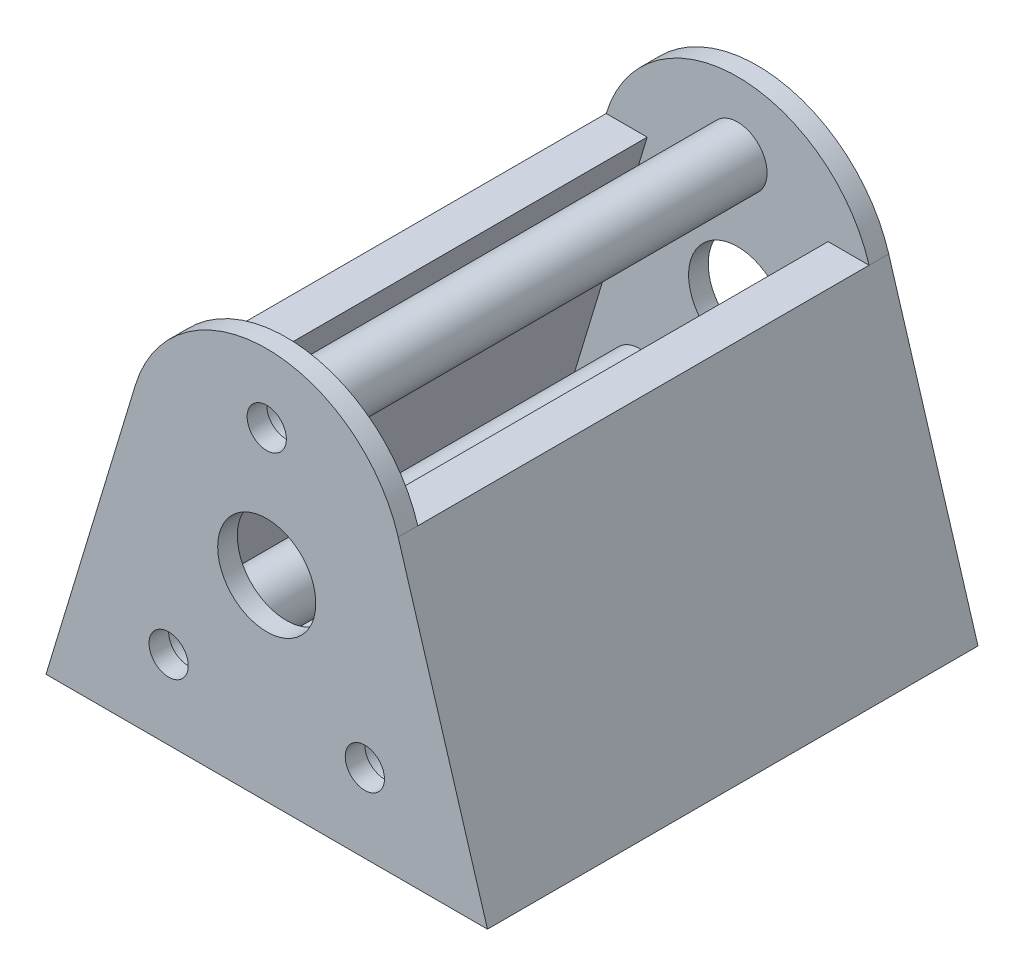
ISO-10303-21;
HEADER;
FILE_DESCRIPTION(('STEP AP214'),'2;1');
FILE_NAME('part.step','',(''),(''),'','','');
FILE_SCHEMA(('AUTOMOTIVE_DESIGN { 1 0 10303 214 1 1 1 1 }'));
ENDSEC;
DATA;
#1=APPLICATION_CONTEXT('core data for automotive mechanical design processes');
#2=APPLICATION_PROTOCOL_DEFINITION('international standard','automotive_design',2000,#1);
#3=PRODUCT_CONTEXT('',#1,'mechanical');
#4=PRODUCT('Part','Part','',(#3));
#5=PRODUCT_RELATED_PRODUCT_CATEGORY('part','',(#4));
#6=PRODUCT_DEFINITION_FORMATION('','',#4);
#7=PRODUCT_DEFINITION_CONTEXT('part definition',#1,'design');
#8=PRODUCT_DEFINITION('design','',#6,#7);
#9=PRODUCT_DEFINITION_SHAPE('','',#8);
#10=(LENGTH_UNIT() NAMED_UNIT(*) SI_UNIT(.MILLI.,.METRE.));
#11=(NAMED_UNIT(*) PLANE_ANGLE_UNIT() SI_UNIT($,.RADIAN.));
#12=(NAMED_UNIT(*) SI_UNIT($,.STERADIAN.) SOLID_ANGLE_UNIT());
#13=UNCERTAINTY_MEASURE_WITH_UNIT(LENGTH_MEASURE(1.E-05),#10,'distance_accuracy_value','');
#14=(GEOMETRIC_REPRESENTATION_CONTEXT(3) GLOBAL_UNCERTAINTY_ASSIGNED_CONTEXT((#13)) GLOBAL_UNIT_ASSIGNED_CONTEXT((#10,
#11,#12)) REPRESENTATION_CONTEXT('',''));
#15=CARTESIAN_POINT('',(0.,0.,0.));
#16=DIRECTION('',(0.,0.,1.));
#17=DIRECTION('',(1.,0.,0.));
#18=AXIS2_PLACEMENT_3D('',#15,#16,#17);
#19=CARTESIAN_POINT('',(-21.2888720410698,4.,-43.1774279923061));
#20=DIRECTION('',(0.,-1.,0.));
#21=DIRECTION('',(1.,0.,0.));
#22=AXIS2_PLACEMENT_3D('',#19,#20,#21);
#23=PLANE('',#22);
#24=DIRECTION('',(0.,0.,1.));
#25=VECTOR('',#24,1.);
#26=CARTESIAN_POINT('',(17.1095382505116,4.,-26.7163630754693));
#27=LINE('',#26,#25);
#28=CARTESIAN_POINT('',(17.1095382505116,4.,2.));
#29=VERTEX_POINT('',#28);
#30=CARTESIAN_POINT('',(17.1095382505116,4.,48.));
#31=VERTEX_POINT('',#30);
#32=EDGE_CURVE('E128',#29,#31,#27,.T.);
#33=ORIENTED_EDGE('',*,*,#32,.F.);
#34=DIRECTION('',(-1.,0.,0.));
#35=VECTOR('',#34,1.);
#36=CARTESIAN_POINT('',(-21.2888720410698,4.,2.));
#37=LINE('',#36,#35);
#38=CARTESIAN_POINT('',(-17.1095382505116,4.,2.));
#39=VERTEX_POINT('',#38);
#40=EDGE_CURVE('E132',#29,#39,#37,.T.);
#41=ORIENTED_EDGE('',*,*,#40,.T.);
#42=DIRECTION('',(0.,0.,1.));
#43=VECTOR('',#42,1.);
#44=CARTESIAN_POINT('',(-17.1095382505116,4.,-26.7163630754693));
#45=LINE('',#44,#43);
#46=CARTESIAN_POINT('',(-17.1095382505116,4.,48.));
#47=VERTEX_POINT('',#46);
#48=EDGE_CURVE('E130',#39,#47,#45,.T.);
#49=ORIENTED_EDGE('',*,*,#48,.T.);
#50=DIRECTION('',(1.,0.,0.));
#51=VECTOR('',#50,1.);
#52=CARTESIAN_POINT('',(-21.2888720410698,4.,48.));
#53=LINE('',#52,#51);
#54=EDGE_CURVE('E126',#47,#31,#53,.T.);
#55=ORIENTED_EDGE('',*,*,#54,.T.);
#56=EDGE_LOOP('',(#33,#41,#49,#55));
#57=FACE_BOUND('',#56,.T.);
#58=ADVANCED_FACE('F48',(#57),#23,.F.);
#59=CARTESIAN_POINT('',(0.,26.,2.));
#60=DIRECTION('',(0.,0.,1.));
#61=DIRECTION('',(1.,0.,0.));
#62=AXIS2_PLACEMENT_3D('',#59,#60,#61);
#63=PLANE('',#62);
#64=DIRECTION('',(1.,0.,0.));
#65=VECTOR('',#64,1.);
#66=CARTESIAN_POINT('',(0.,30.0570560464272,2.));
#67=LINE('',#66,#65);
#68=CARTESIAN_POINT('',(9.21993097420205,30.0570560464272,2.));
#69=VERTEX_POINT('',#68);
#70=CARTESIAN_POINT('',(13.3992647647603,30.0570560464272,2.));
#71=VERTEX_POINT('',#70);
#72=EDGE_CURVE('E143',#69,#71,#67,.T.);
#73=ORIENTED_EDGE('',*,*,#72,.T.);
#74=CARTESIAN_POINT('',(0.,26.,2.));
#75=DIRECTION('',(0.,0.,1.));
#76=DIRECTION('',(1.,0.,0.));
#77=AXIS2_PLACEMENT_3D('',#74,#75,#76);
#78=CIRCLE('',#77,14.);
#79=CARTESIAN_POINT('',(-13.3992647647603,30.0570560464272,2.));
#80=VERTEX_POINT('',#79);
#81=EDGE_CURVE('E257',#71,#80,#78,.T.);
#82=ORIENTED_EDGE('',*,*,#81,.T.);
#83=DIRECTION('',(-1.,0.,0.));
#84=VECTOR('',#83,1.);
#85=CARTESIAN_POINT('',(0.,30.0570560464272,2.));
#86=LINE('',#85,#84);
#87=CARTESIAN_POINT('',(-9.21993097420206,30.0570560464272,2.));
#88=VERTEX_POINT('',#87);
#89=EDGE_CURVE('E133',#88,#80,#86,.T.);
#90=ORIENTED_EDGE('',*,*,#89,.F.);
#91=DIRECTION('',(-0.289789717601945,-0.957090340340025,0.));
#92=VECTOR('',#91,1.);
#93=CARTESIAN_POINT('',(-16.7821318290141,5.08132726714264,2.));
#94=LINE('',#93,#92);
#95=EDGE_CURVE('E151',#88,#39,#94,.T.);
#96=ORIENTED_EDGE('',*,*,#95,.T.);
#97=ORIENTED_EDGE('',*,*,#40,.F.);
#98=DIRECTION('',(0.289789717601945,-0.957090340340025,0.));
#99=VECTOR('',#98,1.);
#100=CARTESIAN_POINT('',(16.7821318290141,5.08132726714264,2.));
#101=LINE('',#100,#99);
#102=EDGE_CURVE('E63',#69,#29,#101,.T.);
#103=ORIENTED_EDGE('',*,*,#102,.F.);
#104=EDGE_LOOP('',(#73,#82,#90,#96,#97,#103));
#105=FACE_BOUND('',#104,.T.);
#106=CARTESIAN_POINT('',(10.,8.00000000000001,2.));
#107=DIRECTION('',(0.,0.,1.));
#108=DIRECTION('',(1.,0.,0.));
#109=AXIS2_PLACEMENT_3D('',#106,#107,#108);
#110=CIRCLE('',#109,3.);
#111=CARTESIAN_POINT('',(13.,8.00000000000001,2.));
#112=VERTEX_POINT('',#111);
#113=EDGE_CURVE('E168',#112,#112,#110,.T.);
#114=ORIENTED_EDGE('',*,*,#113,.F.);
#115=EDGE_LOOP('',(#114));
#116=FACE_BOUND('',#115,.T.);
#117=CARTESIAN_POINT('',(0.,33.,2.));
#118=DIRECTION('',(0.,0.,1.));
#119=DIRECTION('',(1.,0.,0.));
#120=AXIS2_PLACEMENT_3D('',#117,#118,#119);
#121=CIRCLE('',#120,3.);
#122=CARTESIAN_POINT('',(3.,33.,2.));
#123=VERTEX_POINT('',#122);
#124=EDGE_CURVE('E173',#123,#123,#121,.T.);
#125=ORIENTED_EDGE('',*,*,#124,.F.);
#126=EDGE_LOOP('',(#125));
#127=FACE_BOUND('',#126,.T.);
#128=CARTESIAN_POINT('',(-10.,8.,2.));
#129=DIRECTION('',(0.,0.,1.));
#130=DIRECTION('',(1.,0.,0.));
#131=AXIS2_PLACEMENT_3D('',#128,#129,#130);
#132=CIRCLE('',#131,3.);
#133=CARTESIAN_POINT('',(-7.,8.,2.));
#134=VERTEX_POINT('',#133);
#135=EDGE_CURVE('E229',#134,#134,#132,.T.);
#136=ORIENTED_EDGE('',*,*,#135,.F.);
#137=EDGE_LOOP('',(#136));
#138=FACE_BOUND('',#137,.T.);
#139=CARTESIAN_POINT('',(0.,20.,2.));
#140=DIRECTION('',(0.,0.,1.));
#141=DIRECTION('',(1.,0.,0.));
#142=AXIS2_PLACEMENT_3D('',#139,#140,#141);
#143=CIRCLE('',#142,5.);
#144=CARTESIAN_POINT('',(5.,20.,2.));
#145=VERTEX_POINT('',#144);
#146=EDGE_CURVE('E251',#145,#145,#143,.T.);
#147=ORIENTED_EDGE('',*,*,#146,.F.);
#148=EDGE_LOOP('',(#147));
#149=FACE_BOUND('',#148,.T.);
#150=ADVANCED_FACE('F395',(#105,#116,#127,#138,#149),#63,.T.);
#151=CARTESIAN_POINT('',(0.,26.,48.));
#152=DIRECTION('',(0.,0.,-1.));
#153=DIRECTION('',(-1.,0.,0.));
#154=AXIS2_PLACEMENT_3D('',#151,#152,#153);
#155=PLANE('',#154);
#156=DIRECTION('',(-1.,0.,0.));
#157=VECTOR('',#156,1.);
#158=CARTESIAN_POINT('',(0.,30.0570560464272,48.));
#159=LINE('',#158,#157);
#160=CARTESIAN_POINT('',(13.3992647647603,30.0570560464272,48.));
#161=VERTEX_POINT('',#160);
#162=CARTESIAN_POINT('',(9.21993097420205,30.0570560464272,48.));
#163=VERTEX_POINT('',#162);
#164=EDGE_CURVE('E71',#161,#163,#159,.T.);
#165=ORIENTED_EDGE('',*,*,#164,.T.);
#166=DIRECTION('',(-0.289789717601945,0.957090340340025,0.));
#167=VECTOR('',#166,1.);
#168=CARTESIAN_POINT('',(16.7821318290141,5.08132726714264,48.));
#169=LINE('',#168,#167);
#170=EDGE_CURVE('E136',#31,#163,#169,.T.);
#171=ORIENTED_EDGE('',*,*,#170,.F.);
#172=ORIENTED_EDGE('',*,*,#54,.F.);
#173=DIRECTION('',(0.289789717601945,0.957090340340025,0.));
#174=VECTOR('',#173,1.);
#175=CARTESIAN_POINT('',(-16.7821318290141,5.08132726714264,48.));
#176=LINE('',#175,#174);
#177=CARTESIAN_POINT('',(-9.21993097420206,30.0570560464272,48.));
#178=VERTEX_POINT('',#177);
#179=EDGE_CURVE('E160',#47,#178,#176,.T.);
#180=ORIENTED_EDGE('',*,*,#179,.T.);
#181=DIRECTION('',(1.,0.,0.));
#182=VECTOR('',#181,1.);
#183=CARTESIAN_POINT('',(0.,30.0570560464272,48.));
#184=LINE('',#183,#182);
#185=CARTESIAN_POINT('',(-13.3992647647603,30.0570560464272,48.));
#186=VERTEX_POINT('',#185);
#187=EDGE_CURVE('E157',#186,#178,#184,.T.);
#188=ORIENTED_EDGE('',*,*,#187,.F.);
#189=CARTESIAN_POINT('',(0.,26.,48.));
#190=DIRECTION('',(0.,0.,-1.));
#191=DIRECTION('',(-1.,0.,0.));
#192=AXIS2_PLACEMENT_3D('',#189,#190,#191);
#193=CIRCLE('',#192,14.);
#194=EDGE_CURVE('E206',#186,#161,#193,.T.);
#195=ORIENTED_EDGE('',*,*,#194,.T.);
#196=EDGE_LOOP('',(#165,#171,#172,#180,#188,#195));
#197=FACE_BOUND('',#196,.T.);
#198=CARTESIAN_POINT('',(10.,8.00000000000001,48.));
#199=DIRECTION('',(0.,0.,-1.));
#200=DIRECTION('',(1.,0.,0.));
#201=AXIS2_PLACEMENT_3D('',#198,#199,#200);
#202=CIRCLE('',#201,3.);
#203=CARTESIAN_POINT('',(13.,8.00000000000001,48.));
#204=VERTEX_POINT('',#203);
#205=EDGE_CURVE('E170',#204,#204,#202,.T.);
#206=ORIENTED_EDGE('',*,*,#205,.F.);
#207=EDGE_LOOP('',(#206));
#208=FACE_BOUND('',#207,.T.);
#209=CARTESIAN_POINT('',(0.,33.,48.));
#210=DIRECTION('',(0.,0.,-1.));
#211=DIRECTION('',(-1.,0.,0.));
#212=AXIS2_PLACEMENT_3D('',#209,#210,#211);
#213=CIRCLE('',#212,3.);
#214=CARTESIAN_POINT('',(-3.,33.,48.));
#215=VERTEX_POINT('',#214);
#216=EDGE_CURVE('E176',#215,#215,#213,.T.);
#217=ORIENTED_EDGE('',*,*,#216,.F.);
#218=EDGE_LOOP('',(#217));
#219=FACE_BOUND('',#218,.T.);
#220=CARTESIAN_POINT('',(-10.,8.,48.));
#221=DIRECTION('',(0.,0.,-1.));
#222=DIRECTION('',(-1.,0.,0.));
#223=AXIS2_PLACEMENT_3D('',#220,#221,#222);
#224=CIRCLE('',#223,3.);
#225=CARTESIAN_POINT('',(-13.,8.,48.));
#226=VERTEX_POINT('',#225);
#227=EDGE_CURVE('E223',#226,#226,#224,.T.);
#228=ORIENTED_EDGE('',*,*,#227,.F.);
#229=EDGE_LOOP('',(#228));
#230=FACE_BOUND('',#229,.T.);
#231=CARTESIAN_POINT('',(0.,20.,48.));
#232=DIRECTION('',(0.,0.,-1.));
#233=DIRECTION('',(-1.,0.,0.));
#234=AXIS2_PLACEMENT_3D('',#231,#232,#233);
#235=CIRCLE('',#234,5.);
#236=CARTESIAN_POINT('',(-5.00000000000001,20.,48.));
#237=VERTEX_POINT('',#236);
#238=EDGE_CURVE('E188',#237,#237,#235,.T.);
#239=ORIENTED_EDGE('',*,*,#238,.F.);
#240=EDGE_LOOP('',(#239));
#241=FACE_BOUND('',#240,.T.);
#242=ADVANCED_FACE('F137',(#197,#208,#219,#230,#241),#155,.T.);
#243=CARTESIAN_POINT('',(10.,8.,2.));
#244=DIRECTION('',(0.,0.,1.));
#245=DIRECTION('',(1.,0.,0.));
#246=AXIS2_PLACEMENT_3D('',#243,#244,#245);
#247=CIRCLE('',#246,2.);
#248=CARTESIAN_POINT('',(12.,8.,2.));
#249=VERTEX_POINT('',#248);
#250=EDGE_CURVE('E239',#249,#249,#247,.T.);
#251=ORIENTED_EDGE('',*,*,#250,.F.);
#252=EDGE_LOOP('',(#251));
#253=FACE_BOUND('',#252,.T.);
#254=CARTESIAN_POINT('',(10.,8.00000000000001,2.));
#255=DIRECTION('',(0.,0.,1.));
#256=DIRECTION('',(1.,0.,0.));
#257=AXIS2_PLACEMENT_3D('',#254,#255,#256);
#258=CIRCLE('',#257,2.5);
#259=CARTESIAN_POINT('',(12.5,8.00000000000001,2.));
#260=VERTEX_POINT('',#259);
#261=EDGE_CURVE('E291',#260,#260,#258,.F.);
#262=ORIENTED_EDGE('',*,*,#261,.F.);
#263=EDGE_LOOP('',(#262));
#264=FACE_BOUND('',#263,.T.);
#265=ADVANCED_FACE('F401',(#253,#264),#63,.T.);
#266=CARTESIAN_POINT('',(10.,8.,48.));
#267=DIRECTION('',(0.,0.,-1.));
#268=DIRECTION('',(-1.,0.,0.));
#269=AXIS2_PLACEMENT_3D('',#266,#267,#268);
#270=CIRCLE('',#269,2.);
#271=CARTESIAN_POINT('',(8.,8.,48.));
#272=VERTEX_POINT('',#271);
#273=EDGE_CURVE('E200',#272,#272,#270,.T.);
#274=ORIENTED_EDGE('',*,*,#273,.F.);
#275=EDGE_LOOP('',(#274));
#276=FACE_BOUND('',#275,.T.);
#277=CARTESIAN_POINT('',(10.,8.00000000000001,48.));
#278=DIRECTION('',(0.,0.,-1.));
#279=DIRECTION('',(-1.,0.,0.));
#280=AXIS2_PLACEMENT_3D('',#277,#278,#279);
#281=CIRCLE('',#280,2.5);
#282=CARTESIAN_POINT('',(7.50000000000001,8.00000000000001,48.));
#283=VERTEX_POINT('',#282);
#284=EDGE_CURVE('E288',#283,#283,#281,.F.);
#285=ORIENTED_EDGE('',*,*,#284,.F.);
#286=EDGE_LOOP('',(#285));
#287=FACE_BOUND('',#286,.T.);
#288=ADVANCED_FACE('F443',(#276,#287),#155,.T.);
#289=CARTESIAN_POINT('',(0.,33.,2.));
#290=DIRECTION('',(0.,0.,1.));
#291=DIRECTION('',(1.,0.,0.));
#292=AXIS2_PLACEMENT_3D('',#289,#290,#291);
#293=CIRCLE('',#292,2.);
#294=CARTESIAN_POINT('',(2.,33.,2.));
#295=VERTEX_POINT('',#294);
#296=EDGE_CURVE('E245',#295,#295,#293,.T.);
#297=ORIENTED_EDGE('',*,*,#296,.F.);
#298=EDGE_LOOP('',(#297));
#299=FACE_BOUND('',#298,.T.);
#300=CARTESIAN_POINT('',(0.,33.,2.));
#301=DIRECTION('',(0.,0.,1.));
#302=DIRECTION('',(1.,0.,0.));
#303=AXIS2_PLACEMENT_3D('',#300,#301,#302);
#304=CIRCLE('',#303,2.5);
#305=CARTESIAN_POINT('',(2.5,33.,2.));
#306=VERTEX_POINT('',#305);
#307=EDGE_CURVE('E285',#306,#306,#304,.F.);
#308=ORIENTED_EDGE('',*,*,#307,.F.);
#309=EDGE_LOOP('',(#308));
#310=FACE_BOUND('',#309,.T.);
#311=ADVANCED_FACE('F499',(#299,#310),#63,.T.);
#312=CARTESIAN_POINT('',(0.,33.,48.));
#313=DIRECTION('',(0.,0.,-1.));
#314=DIRECTION('',(-1.,0.,0.));
#315=AXIS2_PLACEMENT_3D('',#312,#313,#314);
#316=CIRCLE('',#315,2.);
#317=CARTESIAN_POINT('',(-2.,33.,48.));
#318=VERTEX_POINT('',#317);
#319=EDGE_CURVE('E182',#318,#318,#316,.T.);
#320=ORIENTED_EDGE('',*,*,#319,.F.);
#321=EDGE_LOOP('',(#320));
#322=FACE_BOUND('',#321,.T.);
#323=CARTESIAN_POINT('',(0.,33.,48.));
#324=DIRECTION('',(0.,0.,-1.));
#325=DIRECTION('',(-1.,0.,0.));
#326=AXIS2_PLACEMENT_3D('',#323,#324,#325);
#327=CIRCLE('',#326,2.5);
#328=CARTESIAN_POINT('',(-2.5,33.,48.));
#329=VERTEX_POINT('',#328);
#330=EDGE_CURVE('E282',#329,#329,#327,.F.);
#331=ORIENTED_EDGE('',*,*,#330,.F.);
#332=EDGE_LOOP('',(#331));
#333=FACE_BOUND('',#332,.T.);
#334=ADVANCED_FACE('F497',(#322,#333),#155,.T.);
#335=CARTESIAN_POINT('',(-10.,8.,2.));
#336=DIRECTION('',(0.,0.,1.));
#337=DIRECTION('',(1.,0.,0.));
#338=AXIS2_PLACEMENT_3D('',#335,#336,#337);
#339=CIRCLE('',#338,2.);
#340=CARTESIAN_POINT('',(-8.,8.,2.));
#341=VERTEX_POINT('',#340);
#342=EDGE_CURVE('E233',#341,#341,#339,.T.);
#343=ORIENTED_EDGE('',*,*,#342,.F.);
#344=EDGE_LOOP('',(#343));
#345=FACE_BOUND('',#344,.T.);
#346=CARTESIAN_POINT('',(-10.,8.,2.));
#347=DIRECTION('',(0.,0.,1.));
#348=DIRECTION('',(1.,0.,0.));
#349=AXIS2_PLACEMENT_3D('',#346,#347,#348);
#350=CIRCLE('',#349,2.5);
#351=CARTESIAN_POINT('',(-7.5,8.,2.));
#352=VERTEX_POINT('',#351);
#353=EDGE_CURVE('E279',#352,#352,#350,.F.);
#354=ORIENTED_EDGE('',*,*,#353,.F.);
#355=EDGE_LOOP('',(#354));
#356=FACE_BOUND('',#355,.T.);
#357=ADVANCED_FACE('F402',(#345,#356),#63,.T.);
#358=CARTESIAN_POINT('',(0.,26.,0.));
#359=DIRECTION('',(0.,0.,1.));
#360=DIRECTION('',(1.,0.,0.));
#361=AXIS2_PLACEMENT_3D('',#358,#359,#360);
#362=PLANE('',#361);
#363=DIRECTION('',(-0.289789717601945,0.957090340340025,0.));
#364=VECTOR('',#363,1.);
#365=CARTESIAN_POINT('',(22.5,0.,0.));
#366=LINE('',#365,#364);
#367=CARTESIAN_POINT('',(22.5,0.,0.));
#368=VERTEX_POINT('',#367);
#369=CARTESIAN_POINT('',(13.3992647647603,30.0570560464272,0.));
#370=VERTEX_POINT('',#369);
#371=EDGE_CURVE('E254',#368,#370,#366,.T.);
#372=ORIENTED_EDGE('',*,*,#371,.F.);
#373=DIRECTION('',(1.,0.,0.));
#374=VECTOR('',#373,1.);
#375=CARTESIAN_POINT('',(-22.5,0.,0.));
#376=LINE('',#375,#374);
#377=CARTESIAN_POINT('',(-22.5,0.,0.));
#378=VERTEX_POINT('',#377);
#379=EDGE_CURVE('E260',#378,#368,#376,.T.);
#380=ORIENTED_EDGE('',*,*,#379,.F.);
#381=DIRECTION('',(-0.289789717601945,-0.957090340340025,0.));
#382=VECTOR('',#381,1.);
#383=CARTESIAN_POINT('',(-22.5,0.,0.));
#384=LINE('',#383,#382);
#385=CARTESIAN_POINT('',(-13.3992647647603,30.0570560464272,0.));
#386=VERTEX_POINT('',#385);
#387=EDGE_CURVE('E265',#386,#378,#384,.T.);
#388=ORIENTED_EDGE('',*,*,#387,.F.);
#389=CARTESIAN_POINT('',(0.,26.,0.));
#390=DIRECTION('',(0.,0.,1.));
#391=DIRECTION('',(1.,0.,0.));
#392=AXIS2_PLACEMENT_3D('',#389,#390,#391);
#393=CIRCLE('',#392,14.);
#394=EDGE_CURVE('E263',#370,#386,#393,.T.);
#395=ORIENTED_EDGE('',*,*,#394,.F.);
#396=EDGE_LOOP('',(#372,#380,#388,#395));
#397=FACE_BOUND('',#396,.T.);
#398=CARTESIAN_POINT('',(0.,20.,0.));
#399=DIRECTION('',(0.,0.,1.));
#400=DIRECTION('',(1.,0.,0.));
#401=AXIS2_PLACEMENT_3D('',#398,#399,#400);
#402=CIRCLE('',#401,5.);
#403=CARTESIAN_POINT('',(5.,20.,0.));
#404=VERTEX_POINT('',#403);
#405=EDGE_CURVE('E248',#404,#404,#402,.T.);
#406=ORIENTED_EDGE('',*,*,#405,.T.);
#407=EDGE_LOOP('',(#406));
#408=FACE_BOUND('',#407,.T.);
#409=CARTESIAN_POINT('',(0.,33.,0.));
#410=DIRECTION('',(0.,0.,1.));
#411=DIRECTION('',(1.,0.,0.));
#412=AXIS2_PLACEMENT_3D('',#409,#410,#411);
#413=CIRCLE('',#412,2.);
#414=CARTESIAN_POINT('',(2.,33.,0.));
#415=VERTEX_POINT('',#414);
#416=EDGE_CURVE('E242',#415,#415,#413,.T.);
#417=ORIENTED_EDGE('',*,*,#416,.T.);
#418=EDGE_LOOP('',(#417));
#419=FACE_BOUND('',#418,.T.);
#420=CARTESIAN_POINT('',(10.,8.,0.));
#421=DIRECTION('',(0.,0.,1.));
#422=DIRECTION('',(1.,0.,0.));
#423=AXIS2_PLACEMENT_3D('',#420,#421,#422);
#424=CIRCLE('',#423,2.);
#425=CARTESIAN_POINT('',(12.,8.,0.));
#426=VERTEX_POINT('',#425);
#427=EDGE_CURVE('E236',#426,#426,#424,.T.);
#428=ORIENTED_EDGE('',*,*,#427,.T.);
#429=EDGE_LOOP('',(#428));
#430=FACE_BOUND('',#429,.T.);
#431=CARTESIAN_POINT('',(-10.,8.,0.));
#432=DIRECTION('',(0.,0.,1.));
#433=DIRECTION('',(1.,0.,0.));
#434=AXIS2_PLACEMENT_3D('',#431,#432,#433);
#435=CIRCLE('',#434,2.);
#436=CARTESIAN_POINT('',(-8.,8.,0.));
#437=VERTEX_POINT('',#436);
#438=EDGE_CURVE('E232',#437,#437,#435,.T.);
#439=ORIENTED_EDGE('',*,*,#438,.T.);
#440=EDGE_LOOP('',(#439));
#441=FACE_BOUND('',#440,.T.);
#442=ADVANCED_FACE('F325',(#397,#408,#419,#430,#441),#362,.F.);
#443=CARTESIAN_POINT('',(22.5,0.,2.));
#444=DIRECTION('',(-0.957090340340025,-0.289789717601945,0.));
#445=DIRECTION('',(0.289789717601945,-0.957090340340025,0.));
#446=AXIS2_PLACEMENT_3D('',#443,#444,#445);
#447=PLANE('',#446);
#448=DIRECTION('',(0.,0.,-1.));
#449=VECTOR('',#448,1.);
#450=CARTESIAN_POINT('',(13.3992647647603,30.0570560464272,2.));
#451=LINE('',#450,#449);
#452=EDGE_CURVE('E276',#71,#370,#451,.T.);
#453=ORIENTED_EDGE('',*,*,#452,.F.);
#454=DIRECTION('',(0.,0.,1.));
#455=VECTOR('',#454,1.);
#456=CARTESIAN_POINT('',(13.3992647647603,30.0570560464272,-26.7163630754693));
#457=LINE('',#456,#455);
#458=EDGE_CURVE('E147',#71,#161,#457,.T.);
#459=ORIENTED_EDGE('',*,*,#458,.T.);
#460=DIRECTION('',(0.,0.,1.));
#461=VECTOR('',#460,1.);
#462=CARTESIAN_POINT('',(13.3992647647603,30.0570560464272,48.));
#463=LINE('',#462,#461);
#464=CARTESIAN_POINT('',(13.3992647647603,30.0570560464272,50.));
#465=VERTEX_POINT('',#464);
#466=EDGE_CURVE('E208',#161,#465,#463,.T.);
#467=ORIENTED_EDGE('',*,*,#466,.T.);
#468=DIRECTION('',(0.289789717601945,-0.957090340340025,0.));
#469=VECTOR('',#468,1.);
#470=CARTESIAN_POINT('',(13.3992647647603,30.0570560464272,50.));
#471=LINE('',#470,#469);
#472=CARTESIAN_POINT('',(22.5,0.,50.));
#473=VERTEX_POINT('',#472);
#474=EDGE_CURVE('E209',#465,#473,#471,.T.);
#475=ORIENTED_EDGE('',*,*,#474,.T.);
#476=DIRECTION('',(0.,0.,-1.));
#477=VECTOR('',#476,1.);
#478=CARTESIAN_POINT('',(22.5,0.,2.));
#479=LINE('',#478,#477);
#480=EDGE_CURVE('E259',#473,#368,#479,.T.);
#481=ORIENTED_EDGE('',*,*,#480,.T.);
#482=ORIENTED_EDGE('',*,*,#371,.T.);
#483=EDGE_LOOP('',(#453,#459,#467,#475,#481,#482));
#484=FACE_BOUND('',#483,.T.);
#485=ADVANCED_FACE('F50',(#484),#447,.F.);
#486=CARTESIAN_POINT('',(0.,26.,2.));
#487=DIRECTION('',(0.,0.,-1.));
#488=DIRECTION('',(-1.,0.,0.));
#489=AXIS2_PLACEMENT_3D('',#486,#487,#488);
#490=CYLINDRICAL_SURFACE('',#489,14.);
#491=ORIENTED_EDGE('',*,*,#394,.T.);
#492=DIRECTION('',(0.,0.,-1.));
#493=VECTOR('',#492,1.);
#494=CARTESIAN_POINT('',(-13.3992647647603,30.0570560464272,2.));
#495=LINE('',#494,#493);
#496=EDGE_CURVE('E273',#80,#386,#495,.T.);
#497=ORIENTED_EDGE('',*,*,#496,.F.);
#498=ORIENTED_EDGE('',*,*,#81,.F.);
#499=ORIENTED_EDGE('',*,*,#452,.T.);
#500=EDGE_LOOP('',(#491,#497,#498,#499));
#501=FACE_BOUND('',#500,.T.);
#502=ADVANCED_FACE('F330',(#501),#490,.T.);
#503=CARTESIAN_POINT('',(-22.5,0.,2.));
#504=DIRECTION('',(0.957090340340025,-0.289789717601945,0.));
#505=DIRECTION('',(0.289789717601945,0.957090340340025,0.));
#506=AXIS2_PLACEMENT_3D('',#503,#504,#505);
#507=PLANE('',#506);
#508=DIRECTION('',(0.,0.,1.));
#509=VECTOR('',#508,1.);
#510=CARTESIAN_POINT('',(-13.3992647647603,30.0570560464272,48.));
#511=LINE('',#510,#509);
#512=CARTESIAN_POINT('',(-13.3992647647603,30.0570560464272,50.));
#513=VERTEX_POINT('',#512);
#514=EDGE_CURVE('E220',#186,#513,#511,.T.);
#515=ORIENTED_EDGE('',*,*,#514,.F.);
#516=DIRECTION('',(0.,0.,1.));
#517=VECTOR('',#516,1.);
#518=CARTESIAN_POINT('',(-13.3992647647603,30.0570560464272,-26.7163630754693));
#519=LINE('',#518,#517);
#520=EDGE_CURVE('E154',#80,#186,#519,.T.);
#521=ORIENTED_EDGE('',*,*,#520,.F.);
#522=ORIENTED_EDGE('',*,*,#496,.T.);
#523=ORIENTED_EDGE('',*,*,#387,.T.);
#524=DIRECTION('',(0.,0.,-1.));
#525=VECTOR('',#524,1.);
#526=CARTESIAN_POINT('',(-22.5,0.,2.));
#527=LINE('',#526,#525);
#528=CARTESIAN_POINT('',(-22.5,0.,50.));
#529=VERTEX_POINT('',#528);
#530=EDGE_CURVE('E270',#529,#378,#527,.T.);
#531=ORIENTED_EDGE('',*,*,#530,.F.);
#532=DIRECTION('',(0.289789717601945,0.957090340340025,0.));
#533=VECTOR('',#532,1.);
#534=CARTESIAN_POINT('',(-22.5,0.,50.));
#535=LINE('',#534,#533);
#536=EDGE_CURVE('E212',#529,#513,#535,.T.);
#537=ORIENTED_EDGE('',*,*,#536,.T.);
#538=EDGE_LOOP('',(#515,#521,#522,#523,#531,#537));
#539=FACE_BOUND('',#538,.T.);
#540=ADVANCED_FACE('F308',(#539),#507,.F.);
#541=CARTESIAN_POINT('',(-22.5,0.,2.));
#542=DIRECTION('',(0.,1.,0.));
#543=DIRECTION('',(0.,0.,1.));
#544=AXIS2_PLACEMENT_3D('',#541,#542,#543);
#545=PLANE('',#544);
#546=CARTESIAN_POINT('',(11.25,0.,12.5));
#547=DIRECTION('',(0.,1.,0.));
#548=DIRECTION('',(0.,0.,1.));
#549=AXIS2_PLACEMENT_3D('',#546,#547,#548);
#550=CIRCLE('',#549,5.);
#551=CARTESIAN_POINT('',(11.25,0.,17.5));
#552=VERTEX_POINT('',#551);
#553=EDGE_CURVE('E13',#552,#552,#550,.F.);
#554=ORIENTED_EDGE('',*,*,#553,.F.);
#555=EDGE_LOOP('',(#554));
#556=FACE_BOUND('',#555,.T.);
#557=CARTESIAN_POINT('',(11.25,0.,37.5));
#558=DIRECTION('',(0.,1.,0.));
#559=DIRECTION('',(0.,0.,1.));
#560=AXIS2_PLACEMENT_3D('',#557,#558,#559);
#561=CIRCLE('',#560,5.);
#562=CARTESIAN_POINT('',(11.25,0.,42.5));
#563=VERTEX_POINT('',#562);
#564=EDGE_CURVE('E56',#563,#563,#561,.F.);
#565=ORIENTED_EDGE('',*,*,#564,.F.);
#566=EDGE_LOOP('',(#565));
#567=FACE_BOUND('',#566,.T.);
#568=CARTESIAN_POINT('',(-11.25,0.,37.5));
#569=DIRECTION('',(0.,1.,0.));
#570=DIRECTION('',(0.,0.,1.));
#571=AXIS2_PLACEMENT_3D('',#568,#569,#570);
#572=CIRCLE('',#571,5.);
#573=CARTESIAN_POINT('',(-11.25,0.,42.5));
#574=VERTEX_POINT('',#573);
#575=EDGE_CURVE('E297',#574,#574,#572,.F.);
#576=ORIENTED_EDGE('',*,*,#575,.F.);
#577=EDGE_LOOP('',(#576));
#578=FACE_BOUND('',#577,.T.);
#579=CARTESIAN_POINT('',(-11.25,0.,12.5));
#580=DIRECTION('',(0.,1.,0.));
#581=DIRECTION('',(0.,0.,1.));
#582=AXIS2_PLACEMENT_3D('',#579,#580,#581);
#583=CIRCLE('',#582,5.);
#584=CARTESIAN_POINT('',(-11.25,0.,17.5));
#585=VERTEX_POINT('',#584);
#586=EDGE_CURVE('E294',#585,#585,#583,.F.);
#587=ORIENTED_EDGE('',*,*,#586,.F.);
#588=EDGE_LOOP('',(#587));
#589=FACE_BOUND('',#588,.T.);
#590=ORIENTED_EDGE('',*,*,#379,.T.);
#591=ORIENTED_EDGE('',*,*,#480,.F.);
#592=DIRECTION('',(-1.,0.,0.));
#593=VECTOR('',#592,1.);
#594=CARTESIAN_POINT('',(22.5,0.,50.));
#595=LINE('',#594,#593);
#596=EDGE_CURVE('E203',#473,#529,#595,.T.);
#597=ORIENTED_EDGE('',*,*,#596,.T.);
#598=ORIENTED_EDGE('',*,*,#530,.T.);
#599=EDGE_LOOP('',(#590,#591,#597,#598));
#600=FACE_BOUND('',#599,.T.);
#601=ADVANCED_FACE('F304',(#556,#567,#578,#589,#600),#545,.F.);
#602=CARTESIAN_POINT('',(0.,20.,2.));
#603=DIRECTION('',(0.,0.,-1.));
#604=DIRECTION('',(-1.,0.,0.));
#605=AXIS2_PLACEMENT_3D('',#602,#603,#604);
#606=CYLINDRICAL_SURFACE('',#605,5.);
#607=ORIENTED_EDGE('',*,*,#146,.T.);
#608=EDGE_LOOP('',(#607));
#609=FACE_BOUND('',#608,.T.);
#610=ORIENTED_EDGE('',*,*,#405,.F.);
#611=EDGE_LOOP('',(#610));
#612=FACE_BOUND('',#611,.T.);
#613=ADVANCED_FACE('F307',(#609,#612),#606,.F.);
#614=CARTESIAN_POINT('',(0.,33.,2.));
#615=DIRECTION('',(0.,0.,-1.));
#616=DIRECTION('',(-1.,0.,0.));
#617=AXIS2_PLACEMENT_3D('',#614,#615,#616);
#618=CYLINDRICAL_SURFACE('',#617,2.);
#619=ORIENTED_EDGE('',*,*,#296,.T.);
#620=EDGE_LOOP('',(#619));
#621=FACE_BOUND('',#620,.T.);
#622=ORIENTED_EDGE('',*,*,#416,.F.);
#623=EDGE_LOOP('',(#622));
#624=FACE_BOUND('',#623,.T.);
#625=ADVANCED_FACE('F467',(#621,#624),#618,.F.);
#626=CARTESIAN_POINT('',(10.,8.,2.));
#627=DIRECTION('',(0.,0.,-1.));
#628=DIRECTION('',(-1.,0.,0.));
#629=AXIS2_PLACEMENT_3D('',#626,#627,#628);
#630=CYLINDRICAL_SURFACE('',#629,2.);
#631=ORIENTED_EDGE('',*,*,#250,.T.);
#632=EDGE_LOOP('',(#631));
#633=FACE_BOUND('',#632,.T.);
#634=ORIENTED_EDGE('',*,*,#427,.F.);
#635=EDGE_LOOP('',(#634));
#636=FACE_BOUND('',#635,.T.);
#637=ADVANCED_FACE('F463',(#633,#636),#630,.F.);
#638=CARTESIAN_POINT('',(-10.,8.,2.));
#639=DIRECTION('',(0.,0.,-1.));
#640=DIRECTION('',(-1.,0.,0.));
#641=AXIS2_PLACEMENT_3D('',#638,#639,#640);
#642=CYLINDRICAL_SURFACE('',#641,2.);
#643=ORIENTED_EDGE('',*,*,#342,.T.);
#644=EDGE_LOOP('',(#643));
#645=FACE_BOUND('',#644,.T.);
#646=ORIENTED_EDGE('',*,*,#438,.F.);
#647=EDGE_LOOP('',(#646));
#648=FACE_BOUND('',#647,.T.);
#649=ADVANCED_FACE('F456',(#645,#648),#642,.F.);
#650=CARTESIAN_POINT('',(-10.,8.,-6.48528137423857));
#651=DIRECTION('',(0.,0.,1.));
#652=DIRECTION('',(1.,0.,0.));
#653=AXIS2_PLACEMENT_3D('',#650,#651,#652);
#654=CYLINDRICAL_SURFACE('',#653,3.);
#655=ORIENTED_EDGE('',*,*,#135,.T.);
#656=EDGE_LOOP('',(#655));
#657=FACE_BOUND('',#656,.T.);
#658=ORIENTED_EDGE('',*,*,#227,.T.);
#659=EDGE_LOOP('',(#658));
#660=FACE_BOUND('',#659,.T.);
#661=ADVANCED_FACE('F452',(#657,#660),#654,.T.);
#662=CARTESIAN_POINT('',(-10.,8.,-6.48528137423857));
#663=DIRECTION('',(0.,0.,1.));
#664=DIRECTION('',(1.,0.,0.));
#665=AXIS2_PLACEMENT_3D('',#662,#663,#664);
#666=CYLINDRICAL_SURFACE('',#665,2.5);
#667=ORIENTED_EDGE('',*,*,#353,.T.);
#668=EDGE_LOOP('',(#667));
#669=FACE_BOUND('',#668,.T.);
#670=CARTESIAN_POINT('',(-10.,8.,48.));
#671=DIRECTION('',(0.,0.,-1.));
#672=DIRECTION('',(-1.,0.,0.));
#673=AXIS2_PLACEMENT_3D('',#670,#671,#672);
#674=CIRCLE('',#673,2.5);
#675=CARTESIAN_POINT('',(-12.5,8.,48.));
#676=VERTEX_POINT('',#675);
#677=EDGE_CURVE('E226',#676,#676,#674,.T.);
#678=ORIENTED_EDGE('',*,*,#677,.F.);
#679=EDGE_LOOP('',(#678));
#680=FACE_BOUND('',#679,.T.);
#681=ADVANCED_FACE('F455',(#669,#680),#666,.F.);
#682=CARTESIAN_POINT('',(-10.,8.,48.));
#683=DIRECTION('',(0.,0.,-1.));
#684=DIRECTION('',(-1.,0.,0.));
#685=AXIS2_PLACEMENT_3D('',#682,#683,#684);
#686=CIRCLE('',#685,2.);
#687=CARTESIAN_POINT('',(-12.,8.,48.));
#688=VERTEX_POINT('',#687);
#689=EDGE_CURVE('E194',#688,#688,#686,.T.);
#690=ORIENTED_EDGE('',*,*,#689,.F.);
#691=EDGE_LOOP('',(#690));
#692=FACE_BOUND('',#691,.T.);
#693=ORIENTED_EDGE('',*,*,#677,.T.);
#694=EDGE_LOOP('',(#693));
#695=FACE_BOUND('',#694,.T.);
#696=ADVANCED_FACE('F444',(#692,#695),#155,.T.);
#697=CARTESIAN_POINT('',(0.,26.,50.));
#698=DIRECTION('',(0.,0.,-1.));
#699=DIRECTION('',(-1.,0.,0.));
#700=AXIS2_PLACEMENT_3D('',#697,#698,#699);
#701=PLANE('',#700);
#702=ORIENTED_EDGE('',*,*,#596,.F.);
#703=ORIENTED_EDGE('',*,*,#474,.F.);
#704=CARTESIAN_POINT('',(0.,26.,50.));
#705=DIRECTION('',(0.,0.,-1.));
#706=DIRECTION('',(-1.,0.,0.));
#707=AXIS2_PLACEMENT_3D('',#704,#705,#706);
#708=CIRCLE('',#707,14.);
#709=EDGE_CURVE('E214',#513,#465,#708,.T.);
#710=ORIENTED_EDGE('',*,*,#709,.F.);
#711=ORIENTED_EDGE('',*,*,#536,.F.);
#712=EDGE_LOOP('',(#702,#703,#710,#711));
#713=FACE_BOUND('',#712,.T.);
#714=CARTESIAN_POINT('',(10.,8.,50.));
#715=DIRECTION('',(0.,0.,-1.));
#716=DIRECTION('',(-1.,0.,0.));
#717=AXIS2_PLACEMENT_3D('',#714,#715,#716);
#718=CIRCLE('',#717,2.);
#719=CARTESIAN_POINT('',(8.,8.,50.));
#720=VERTEX_POINT('',#719);
#721=EDGE_CURVE('E197',#720,#720,#718,.T.);
#722=ORIENTED_EDGE('',*,*,#721,.T.);
#723=EDGE_LOOP('',(#722));
#724=FACE_BOUND('',#723,.T.);
#725=CARTESIAN_POINT('',(-10.,8.,50.));
#726=DIRECTION('',(0.,0.,-1.));
#727=DIRECTION('',(-1.,0.,0.));
#728=AXIS2_PLACEMENT_3D('',#725,#726,#727);
#729=CIRCLE('',#728,2.);
#730=CARTESIAN_POINT('',(-12.,8.,50.));
#731=VERTEX_POINT('',#730);
#732=EDGE_CURVE('E191',#731,#731,#729,.T.);
#733=ORIENTED_EDGE('',*,*,#732,.T.);
#734=EDGE_LOOP('',(#733));
#735=FACE_BOUND('',#734,.T.);
#736=CARTESIAN_POINT('',(0.,20.,50.));
#737=DIRECTION('',(0.,0.,-1.));
#738=DIRECTION('',(-1.,0.,0.));
#739=AXIS2_PLACEMENT_3D('',#736,#737,#738);
#740=CIRCLE('',#739,5.);
#741=CARTESIAN_POINT('',(-5.00000000000001,20.,50.));
#742=VERTEX_POINT('',#741);
#743=EDGE_CURVE('E185',#742,#742,#740,.T.);
#744=ORIENTED_EDGE('',*,*,#743,.T.);
#745=EDGE_LOOP('',(#744));
#746=FACE_BOUND('',#745,.T.);
#747=CARTESIAN_POINT('',(0.,33.,50.));
#748=DIRECTION('',(0.,0.,-1.));
#749=DIRECTION('',(-1.,0.,0.));
#750=AXIS2_PLACEMENT_3D('',#747,#748,#749);
#751=CIRCLE('',#750,2.);
#752=CARTESIAN_POINT('',(-2.,33.,50.));
#753=VERTEX_POINT('',#752);
#754=EDGE_CURVE('E179',#753,#753,#751,.T.);
#755=ORIENTED_EDGE('',*,*,#754,.T.);
#756=EDGE_LOOP('',(#755));
#757=FACE_BOUND('',#756,.T.);
#758=ADVANCED_FACE('F445',(#713,#724,#735,#746,#757),#701,.F.);
#759=CARTESIAN_POINT('',(0.,26.,48.));
#760=DIRECTION('',(0.,0.,1.));
#761=DIRECTION('',(1.,0.,0.));
#762=AXIS2_PLACEMENT_3D('',#759,#760,#761);
#763=CYLINDRICAL_SURFACE('',#762,14.);
#764=ORIENTED_EDGE('',*,*,#709,.T.);
#765=ORIENTED_EDGE('',*,*,#466,.F.);
#766=ORIENTED_EDGE('',*,*,#194,.F.);
#767=ORIENTED_EDGE('',*,*,#514,.T.);
#768=EDGE_LOOP('',(#764,#765,#766,#767));
#769=FACE_BOUND('',#768,.T.);
#770=ADVANCED_FACE('F439',(#769),#763,.T.);
#771=CARTESIAN_POINT('',(10.,8.,48.));
#772=DIRECTION('',(0.,0.,1.));
#773=DIRECTION('',(1.,0.,0.));
#774=AXIS2_PLACEMENT_3D('',#771,#772,#773);
#775=CYLINDRICAL_SURFACE('',#774,2.);
#776=ORIENTED_EDGE('',*,*,#273,.T.);
#777=EDGE_LOOP('',(#776));
#778=FACE_BOUND('',#777,.T.);
#779=ORIENTED_EDGE('',*,*,#721,.F.);
#780=EDGE_LOOP('',(#779));
#781=FACE_BOUND('',#780,.T.);
#782=ADVANCED_FACE('F435',(#778,#781),#775,.F.);
#783=CARTESIAN_POINT('',(-10.,8.,48.));
#784=DIRECTION('',(0.,0.,1.));
#785=DIRECTION('',(1.,0.,0.));
#786=AXIS2_PLACEMENT_3D('',#783,#784,#785);
#787=CYLINDRICAL_SURFACE('',#786,2.);
#788=ORIENTED_EDGE('',*,*,#689,.T.);
#789=EDGE_LOOP('',(#788));
#790=FACE_BOUND('',#789,.T.);
#791=ORIENTED_EDGE('',*,*,#732,.F.);
#792=EDGE_LOOP('',(#791));
#793=FACE_BOUND('',#792,.T.);
#794=ADVANCED_FACE('F431',(#790,#793),#787,.F.);
#795=CARTESIAN_POINT('',(0.,20.,48.));
#796=DIRECTION('',(0.,0.,1.));
#797=DIRECTION('',(1.,0.,0.));
#798=AXIS2_PLACEMENT_3D('',#795,#796,#797);
#799=CYLINDRICAL_SURFACE('',#798,5.);
#800=ORIENTED_EDGE('',*,*,#238,.T.);
#801=EDGE_LOOP('',(#800));
#802=FACE_BOUND('',#801,.T.);
#803=ORIENTED_EDGE('',*,*,#743,.F.);
#804=EDGE_LOOP('',(#803));
#805=FACE_BOUND('',#804,.T.);
#806=ADVANCED_FACE('F427',(#802,#805),#799,.F.);
#807=CARTESIAN_POINT('',(0.,33.,48.));
#808=DIRECTION('',(0.,0.,1.));
#809=DIRECTION('',(1.,0.,0.));
#810=AXIS2_PLACEMENT_3D('',#807,#808,#809);
#811=CYLINDRICAL_SURFACE('',#810,2.);
#812=ORIENTED_EDGE('',*,*,#319,.T.);
#813=EDGE_LOOP('',(#812));
#814=FACE_BOUND('',#813,.T.);
#815=ORIENTED_EDGE('',*,*,#754,.F.);
#816=EDGE_LOOP('',(#815));
#817=FACE_BOUND('',#816,.T.);
#818=ADVANCED_FACE('F423',(#814,#817),#811,.F.);
#819=CARTESIAN_POINT('',(0.,33.,-6.48528137423857));
#820=DIRECTION('',(0.,0.,1.));
#821=DIRECTION('',(1.,0.,0.));
#822=AXIS2_PLACEMENT_3D('',#819,#820,#821);
#823=CYLINDRICAL_SURFACE('',#822,2.5);
#824=ORIENTED_EDGE('',*,*,#307,.T.);
#825=EDGE_LOOP('',(#824));
#826=FACE_BOUND('',#825,.T.);
#827=ORIENTED_EDGE('',*,*,#330,.T.);
#828=EDGE_LOOP('',(#827));
#829=FACE_BOUND('',#828,.T.);
#830=ADVANCED_FACE('F419',(#826,#829),#823,.F.);
#831=CARTESIAN_POINT('',(0.,33.,-6.48528137423857));
#832=DIRECTION('',(0.,0.,1.));
#833=DIRECTION('',(1.,0.,0.));
#834=AXIS2_PLACEMENT_3D('',#831,#832,#833);
#835=CYLINDRICAL_SURFACE('',#834,3.);
#836=ORIENTED_EDGE('',*,*,#124,.T.);
#837=EDGE_LOOP('',(#836));
#838=FACE_BOUND('',#837,.T.);
#839=ORIENTED_EDGE('',*,*,#216,.T.);
#840=EDGE_LOOP('',(#839));
#841=FACE_BOUND('',#840,.T.);
#842=ADVANCED_FACE('F415',(#838,#841),#835,.T.);
#843=CARTESIAN_POINT('',(10.,8.00000000000001,-6.48528137423857));
#844=DIRECTION('',(0.,0.,1.));
#845=DIRECTION('',(1.,0.,0.));
#846=AXIS2_PLACEMENT_3D('',#843,#844,#845);
#847=CYLINDRICAL_SURFACE('',#846,2.5);
#848=ORIENTED_EDGE('',*,*,#261,.T.);
#849=EDGE_LOOP('',(#848));
#850=FACE_BOUND('',#849,.T.);
#851=ORIENTED_EDGE('',*,*,#284,.T.);
#852=EDGE_LOOP('',(#851));
#853=FACE_BOUND('',#852,.T.);
#854=ADVANCED_FACE('F411',(#850,#853),#847,.F.);
#855=CARTESIAN_POINT('',(10.,8.00000000000001,-6.48528137423857));
#856=DIRECTION('',(0.,0.,1.));
#857=DIRECTION('',(1.,0.,0.));
#858=AXIS2_PLACEMENT_3D('',#855,#856,#857);
#859=CYLINDRICAL_SURFACE('',#858,3.);
#860=ORIENTED_EDGE('',*,*,#113,.T.);
#861=EDGE_LOOP('',(#860));
#862=FACE_BOUND('',#861,.T.);
#863=ORIENTED_EDGE('',*,*,#205,.T.);
#864=EDGE_LOOP('',(#863));
#865=FACE_BOUND('',#864,.T.);
#866=ADVANCED_FACE('F407',(#862,#865),#859,.T.);
#867=CARTESIAN_POINT('',(-16.7821318290141,5.08132726714264,-26.7163630754693));
#868=DIRECTION('',(0.957090340340025,-0.289789717601945,0.));
#869=DIRECTION('',(0.289789717601945,0.957090340340025,0.));
#870=AXIS2_PLACEMENT_3D('',#867,#868,#869);
#871=PLANE('',#870);
#872=ORIENTED_EDGE('',*,*,#95,.F.);
#873=DIRECTION('',(0.,0.,1.));
#874=VECTOR('',#873,1.);
#875=CARTESIAN_POINT('',(-9.21993097420206,30.0570560464272,-26.7163630754693));
#876=LINE('',#875,#874);
#877=EDGE_CURVE('E163',#88,#178,#876,.T.);
#878=ORIENTED_EDGE('',*,*,#877,.T.);
#879=ORIENTED_EDGE('',*,*,#179,.F.);
#880=ORIENTED_EDGE('',*,*,#48,.F.);
#881=EDGE_LOOP('',(#872,#878,#879,#880));
#882=FACE_BOUND('',#881,.T.);
#883=ADVANCED_FACE('F410',(#882),#871,.T.);
#884=CARTESIAN_POINT('',(0.,30.0570560464272,-26.7163630754693));
#885=DIRECTION('',(0.,-1.,0.));
#886=DIRECTION('',(0.,0.,-1.));
#887=AXIS2_PLACEMENT_3D('',#884,#885,#886);
#888=PLANE('',#887);
#889=ORIENTED_EDGE('',*,*,#877,.F.);
#890=ORIENTED_EDGE('',*,*,#89,.T.);
#891=ORIENTED_EDGE('',*,*,#520,.T.);
#892=ORIENTED_EDGE('',*,*,#187,.T.);
#893=EDGE_LOOP('',(#889,#890,#891,#892));
#894=FACE_BOUND('',#893,.T.);
#895=ADVANCED_FACE('F405',(#894),#888,.F.);
#896=CARTESIAN_POINT('',(0.,30.0570560464272,-26.7163630754693));
#897=DIRECTION('',(0.,1.,0.));
#898=DIRECTION('',(-1.,0.,0.));
#899=AXIS2_PLACEMENT_3D('',#896,#897,#898);
#900=PLANE('',#899);
#901=ORIENTED_EDGE('',*,*,#72,.F.);
#902=DIRECTION('',(0.,0.,1.));
#903=VECTOR('',#902,1.);
#904=CARTESIAN_POINT('',(9.21993097420205,30.0570560464272,-26.7163630754693));
#905=LINE('',#904,#903);
#906=EDGE_CURVE('E144',#69,#163,#905,.T.);
#907=ORIENTED_EDGE('',*,*,#906,.T.);
#908=ORIENTED_EDGE('',*,*,#164,.F.);
#909=ORIENTED_EDGE('',*,*,#458,.F.);
#910=EDGE_LOOP('',(#901,#907,#908,#909));
#911=FACE_BOUND('',#910,.T.);
#912=ADVANCED_FACE('F335',(#911),#900,.T.);
#913=CARTESIAN_POINT('',(16.7821318290141,5.08132726714264,-26.7163630754693));
#914=DIRECTION('',(0.957090340340025,0.289789717601945,0.));
#915=DIRECTION('',(-0.289789717601945,0.957090340340025,0.));
#916=AXIS2_PLACEMENT_3D('',#913,#914,#915);
#917=PLANE('',#916);
#918=ORIENTED_EDGE('',*,*,#906,.F.);
#919=ORIENTED_EDGE('',*,*,#102,.T.);
#920=ORIENTED_EDGE('',*,*,#32,.T.);
#921=ORIENTED_EDGE('',*,*,#170,.T.);
#922=EDGE_LOOP('',(#918,#919,#920,#921));
#923=FACE_BOUND('',#922,.T.);
#924=ADVANCED_FACE('F142',(#923),#917,.F.);
#925=CARTESIAN_POINT('',(-11.25,-5.,12.5));
#926=DIRECTION('',(0.,-1.,0.));
#927=DIRECTION('',(0.,0.,-1.));
#928=AXIS2_PLACEMENT_3D('',#925,#926,#927);
#929=PLANE('',#928);
#930=CARTESIAN_POINT('',(-11.25,-5.,12.5));
#931=DIRECTION('',(0.,-1.,0.));
#932=DIRECTION('',(0.,0.,-1.));
#933=AXIS2_PLACEMENT_3D('',#930,#931,#932);
#934=CIRCLE('',#933,5.);
#935=CARTESIAN_POINT('',(-11.25,-5.,7.5));
#936=VERTEX_POINT('',#935);
#937=EDGE_CURVE('E140',#936,#936,#934,.T.);
#938=ORIENTED_EDGE('',*,*,#937,.T.);
#939=EDGE_LOOP('',(#938));
#940=FACE_BOUND('',#939,.T.);
#941=CARTESIAN_POINT('',(-11.25,-5.,12.5));
#942=DIRECTION('',(0.,-1.,0.));
#943=DIRECTION('',(0.,0.,-1.));
#944=AXIS2_PLACEMENT_3D('',#941,#942,#943);
#945=CIRCLE('',#944,2.5);
#946=CARTESIAN_POINT('',(-11.25,-5.,10.));
#947=VERTEX_POINT('',#946);
#948=EDGE_CURVE('E341',#947,#947,#945,.T.);
#949=ORIENTED_EDGE('',*,*,#948,.F.);
#950=EDGE_LOOP('',(#949));
#951=FACE_BOUND('',#950,.T.);
#952=ADVANCED_FACE('F677',(#940,#951),#929,.T.);
#953=CARTESIAN_POINT('',(-11.25,-5.,12.5));
#954=DIRECTION('',(0.,1.,0.));
#955=DIRECTION('',(0.,0.,1.));
#956=AXIS2_PLACEMENT_3D('',#953,#954,#955);
#957=CYLINDRICAL_SURFACE('',#956,5.);
#958=ORIENTED_EDGE('',*,*,#937,.F.);
#959=EDGE_LOOP('',(#958));
#960=FACE_BOUND('',#959,.T.);
#961=ORIENTED_EDGE('',*,*,#586,.T.);
#962=EDGE_LOOP('',(#961));
#963=FACE_BOUND('',#962,.T.);
#964=ADVANCED_FACE('F686',(#960,#963),#957,.T.);
#965=CARTESIAN_POINT('',(-11.25,-5.,12.5));
#966=DIRECTION('',(0.,1.,0.));
#967=DIRECTION('',(0.,0.,1.));
#968=AXIS2_PLACEMENT_3D('',#965,#966,#967);
#969=CYLINDRICAL_SURFACE('',#968,2.5);
#970=ORIENTED_EDGE('',*,*,#948,.T.);
#971=EDGE_LOOP('',(#970));
#972=FACE_BOUND('',#971,.T.);
#973=CARTESIAN_POINT('',(-11.25,0.,12.5));
#974=DIRECTION('',(0.,-1.,0.));
#975=DIRECTION('',(0.,0.,-1.));
#976=AXIS2_PLACEMENT_3D('',#973,#974,#975);
#977=CIRCLE('',#976,2.5);
#978=CARTESIAN_POINT('',(-11.25,0.,10.));
#979=VERTEX_POINT('',#978);
#980=EDGE_CURVE('E342',#979,#979,#977,.T.);
#981=ORIENTED_EDGE('',*,*,#980,.F.);
#982=EDGE_LOOP('',(#981));
#983=FACE_BOUND('',#982,.T.);
#984=ADVANCED_FACE('F694',(#972,#983),#969,.F.);
#985=ORIENTED_EDGE('',*,*,#980,.T.);
#986=EDGE_LOOP('',(#985));
#987=FACE_BOUND('',#986,.T.);
#988=ADVANCED_FACE('F312',(#987),#545,.F.);
#989=CARTESIAN_POINT('',(-11.25,-5.,37.5));
#990=DIRECTION('',(0.,1.,0.));
#991=DIRECTION('',(0.,0.,1.));
#992=AXIS2_PLACEMENT_3D('',#989,#990,#991);
#993=PLANE('',#992);
#994=CARTESIAN_POINT('',(-11.25,-5.,37.5));
#995=DIRECTION('',(0.,-1.,0.));
#996=DIRECTION('',(0.,0.,1.));
#997=AXIS2_PLACEMENT_3D('',#994,#995,#996);
#998=CIRCLE('',#997,5.);
#999=CARTESIAN_POINT('',(-11.25,-5.,42.5));
#1000=VERTEX_POINT('',#999);
#1001=EDGE_CURVE('E345',#1000,#1000,#998,.T.);
#1002=ORIENTED_EDGE('',*,*,#1001,.T.);
#1003=EDGE_LOOP('',(#1002));
#1004=FACE_BOUND('',#1003,.T.);
#1005=CARTESIAN_POINT('',(-11.25,-5.,37.5));
#1006=DIRECTION('',(0.,-1.,0.));
#1007=DIRECTION('',(0.,0.,1.));
#1008=AXIS2_PLACEMENT_3D('',#1005,#1006,#1007);
#1009=CIRCLE('',#1008,2.5);
#1010=CARTESIAN_POINT('',(-11.25,-5.,40.));
#1011=VERTEX_POINT('',#1010);
#1012=EDGE_CURVE('E350',#1011,#1011,#1009,.T.);
#1013=ORIENTED_EDGE('',*,*,#1012,.F.);
#1014=EDGE_LOOP('',(#1013));
#1015=FACE_BOUND('',#1014,.T.);
#1016=ADVANCED_FACE('F709',(#1004,#1015),#993,.F.);
#1017=CARTESIAN_POINT('',(-11.25,-5.,37.5));
#1018=DIRECTION('',(0.,1.,0.));
#1019=DIRECTION('',(0.,0.,1.));
#1020=AXIS2_PLACEMENT_3D('',#1017,#1018,#1019);
#1021=CYLINDRICAL_SURFACE('',#1020,5.);
#1022=ORIENTED_EDGE('',*,*,#1001,.F.);
#1023=EDGE_LOOP('',(#1022));
#1024=FACE_BOUND('',#1023,.T.);
#1025=ORIENTED_EDGE('',*,*,#575,.T.);
#1026=EDGE_LOOP('',(#1025));
#1027=FACE_BOUND('',#1026,.T.);
#1028=ADVANCED_FACE('F716',(#1024,#1027),#1021,.T.);
#1029=CARTESIAN_POINT('',(-11.25,-5.,37.5));
#1030=DIRECTION('',(0.,1.,0.));
#1031=DIRECTION('',(0.,0.,1.));
#1032=AXIS2_PLACEMENT_3D('',#1029,#1030,#1031);
#1033=CYLINDRICAL_SURFACE('',#1032,2.5);
#1034=ORIENTED_EDGE('',*,*,#1012,.T.);
#1035=EDGE_LOOP('',(#1034));
#1036=FACE_BOUND('',#1035,.T.);
#1037=CARTESIAN_POINT('',(-11.25,0.,37.5));
#1038=DIRECTION('',(0.,-1.,0.));
#1039=DIRECTION('',(0.,0.,1.));
#1040=AXIS2_PLACEMENT_3D('',#1037,#1038,#1039);
#1041=CIRCLE('',#1040,2.5);
#1042=CARTESIAN_POINT('',(-11.25,0.,40.));
#1043=VERTEX_POINT('',#1042);
#1044=EDGE_CURVE('E351',#1043,#1043,#1041,.T.);
#1045=ORIENTED_EDGE('',*,*,#1044,.F.);
#1046=EDGE_LOOP('',(#1045));
#1047=FACE_BOUND('',#1046,.T.);
#1048=ADVANCED_FACE('F724',(#1036,#1047),#1033,.F.);
#1049=ORIENTED_EDGE('',*,*,#1044,.T.);
#1050=EDGE_LOOP('',(#1049));
#1051=FACE_BOUND('',#1050,.T.);
#1052=ADVANCED_FACE('F392',(#1051),#545,.F.);
#1053=CARTESIAN_POINT('',(11.25,-5.,37.5));
#1054=DIRECTION('',(0.,-1.,0.));
#1055=DIRECTION('',(0.,0.,-1.));
#1056=AXIS2_PLACEMENT_3D('',#1053,#1054,#1055);
#1057=PLANE('',#1056);
#1058=CARTESIAN_POINT('',(11.25,-5.,37.5));
#1059=DIRECTION('',(0.,-1.,0.));
#1060=DIRECTION('',(0.,0.,-1.));
#1061=AXIS2_PLACEMENT_3D('',#1058,#1059,#1060);
#1062=CIRCLE('',#1061,5.);
#1063=CARTESIAN_POINT('',(11.25,-5.,32.5));
#1064=VERTEX_POINT('',#1063);
#1065=EDGE_CURVE('E354',#1064,#1064,#1062,.T.);
#1066=ORIENTED_EDGE('',*,*,#1065,.T.);
#1067=EDGE_LOOP('',(#1066));
#1068=FACE_BOUND('',#1067,.T.);
#1069=CARTESIAN_POINT('',(11.25,-5.,37.5));
#1070=DIRECTION('',(0.,-1.,0.));
#1071=DIRECTION('',(0.,0.,-1.));
#1072=AXIS2_PLACEMENT_3D('',#1069,#1070,#1071);
#1073=CIRCLE('',#1072,2.5);
#1074=CARTESIAN_POINT('',(11.25,-5.,35.));
#1075=VERTEX_POINT('',#1074);
#1076=EDGE_CURVE('E359',#1075,#1075,#1073,.T.);
#1077=ORIENTED_EDGE('',*,*,#1076,.F.);
#1078=EDGE_LOOP('',(#1077));
#1079=FACE_BOUND('',#1078,.T.);
#1080=ADVANCED_FACE('F739',(#1068,#1079),#1057,.T.);
#1081=CARTESIAN_POINT('',(11.25,-5.,37.5));
#1082=DIRECTION('',(0.,1.,0.));
#1083=DIRECTION('',(0.,0.,1.));
#1084=AXIS2_PLACEMENT_3D('',#1081,#1082,#1083);
#1085=CYLINDRICAL_SURFACE('',#1084,5.);
#1086=ORIENTED_EDGE('',*,*,#1065,.F.);
#1087=EDGE_LOOP('',(#1086));
#1088=FACE_BOUND('',#1087,.T.);
#1089=ORIENTED_EDGE('',*,*,#564,.T.);
#1090=EDGE_LOOP('',(#1089));
#1091=FACE_BOUND('',#1090,.T.);
#1092=ADVANCED_FACE('F302',(#1088,#1091),#1085,.T.);
#1093=CARTESIAN_POINT('',(11.25,-5.,37.5));
#1094=DIRECTION('',(0.,1.,0.));
#1095=DIRECTION('',(0.,0.,1.));
#1096=AXIS2_PLACEMENT_3D('',#1093,#1094,#1095);
#1097=CYLINDRICAL_SURFACE('',#1096,2.5);
#1098=ORIENTED_EDGE('',*,*,#1076,.T.);
#1099=EDGE_LOOP('',(#1098));
#1100=FACE_BOUND('',#1099,.T.);
#1101=CARTESIAN_POINT('',(11.25,0.,37.5));
#1102=DIRECTION('',(0.,-1.,0.));
#1103=DIRECTION('',(0.,0.,-1.));
#1104=AXIS2_PLACEMENT_3D('',#1101,#1102,#1103);
#1105=CIRCLE('',#1104,2.5);
#1106=CARTESIAN_POINT('',(11.25,0.,35.));
#1107=VERTEX_POINT('',#1106);
#1108=EDGE_CURVE('E360',#1107,#1107,#1105,.T.);
#1109=ORIENTED_EDGE('',*,*,#1108,.F.);
#1110=EDGE_LOOP('',(#1109));
#1111=FACE_BOUND('',#1110,.T.);
#1112=ADVANCED_FACE('F390',(#1100,#1111),#1097,.F.);
#1113=ORIENTED_EDGE('',*,*,#1108,.T.);
#1114=EDGE_LOOP('',(#1113));
#1115=FACE_BOUND('',#1114,.T.);
#1116=ADVANCED_FACE('F381',(#1115),#545,.F.);
#1117=CARTESIAN_POINT('',(11.25,-5.,12.5));
#1118=DIRECTION('',(0.,1.,0.));
#1119=DIRECTION('',(0.,0.,1.));
#1120=AXIS2_PLACEMENT_3D('',#1117,#1118,#1119);
#1121=PLANE('',#1120);
#1122=CARTESIAN_POINT('',(11.25,-5.,12.5));
#1123=DIRECTION('',(0.,-1.,0.));
#1124=DIRECTION('',(0.,0.,1.));
#1125=AXIS2_PLACEMENT_3D('',#1122,#1123,#1124);
#1126=CIRCLE('',#1125,5.);
#1127=CARTESIAN_POINT('',(11.25,-5.,17.5));
#1128=VERTEX_POINT('',#1127);
#1129=EDGE_CURVE('E363',#1128,#1128,#1126,.T.);
#1130=ORIENTED_EDGE('',*,*,#1129,.T.);
#1131=EDGE_LOOP('',(#1130));
#1132=FACE_BOUND('',#1131,.T.);
#1133=CARTESIAN_POINT('',(11.25,-5.,12.5));
#1134=DIRECTION('',(0.,-1.,0.));
#1135=DIRECTION('',(0.,0.,1.));
#1136=AXIS2_PLACEMENT_3D('',#1133,#1134,#1135);
#1137=CIRCLE('',#1136,2.5);
#1138=CARTESIAN_POINT('',(11.25,-5.,15.));
#1139=VERTEX_POINT('',#1138);
#1140=EDGE_CURVE('E368',#1139,#1139,#1137,.T.);
#1141=ORIENTED_EDGE('',*,*,#1140,.F.);
#1142=EDGE_LOOP('',(#1141));
#1143=FACE_BOUND('',#1142,.T.);
#1144=ADVANCED_FACE('F378',(#1132,#1143),#1121,.F.);
#1145=CARTESIAN_POINT('',(11.25,-5.,12.5));
#1146=DIRECTION('',(0.,1.,0.));
#1147=DIRECTION('',(0.,0.,1.));
#1148=AXIS2_PLACEMENT_3D('',#1145,#1146,#1147);
#1149=CYLINDRICAL_SURFACE('',#1148,5.);
#1150=ORIENTED_EDGE('',*,*,#1129,.F.);
#1151=EDGE_LOOP('',(#1150));
#1152=FACE_BOUND('',#1151,.T.);
#1153=ORIENTED_EDGE('',*,*,#553,.T.);
#1154=EDGE_LOOP('',(#1153));
#1155=FACE_BOUND('',#1154,.T.);
#1156=ADVANCED_FACE('F380',(#1152,#1155),#1149,.T.);
#1157=CARTESIAN_POINT('',(11.25,-5.,12.5));
#1158=DIRECTION('',(0.,1.,0.));
#1159=DIRECTION('',(0.,0.,1.));
#1160=AXIS2_PLACEMENT_3D('',#1157,#1158,#1159);
#1161=CYLINDRICAL_SURFACE('',#1160,2.5);
#1162=ORIENTED_EDGE('',*,*,#1140,.T.);
#1163=EDGE_LOOP('',(#1162));
#1164=FACE_BOUND('',#1163,.T.);
#1165=CARTESIAN_POINT('',(11.25,0.,12.5));
#1166=DIRECTION('',(0.,-1.,0.));
#1167=DIRECTION('',(0.,0.,1.));
#1168=AXIS2_PLACEMENT_3D('',#1165,#1166,#1167);
#1169=CIRCLE('',#1168,2.5);
#1170=CARTESIAN_POINT('',(11.25,0.,15.));
#1171=VERTEX_POINT('',#1170);
#1172=EDGE_CURVE('E369',#1171,#1171,#1169,.T.);
#1173=ORIENTED_EDGE('',*,*,#1172,.F.);
#1174=EDGE_LOOP('',(#1173));
#1175=FACE_BOUND('',#1174,.T.);
#1176=ADVANCED_FACE('F375',(#1164,#1175),#1161,.F.);
#1177=ORIENTED_EDGE('',*,*,#1172,.T.);
#1178=EDGE_LOOP('',(#1177));
#1179=FACE_BOUND('',#1178,.T.);
#1180=ADVANCED_FACE('F311',(#1179),#545,.F.);
#1181=CLOSED_SHELL('',(#58,#150,#242,#265,#288,#311,#334,#357,#442,#485,#502,#540,#601,#613,
#625,#637,#649,#661,#681,#696,#758,#770,#782,#794,#806,#818,#830,#842,#854,#866,#883,#895,#912,
#924,#952,#964,#984,#988,#1016,#1028,#1048,#1052,#1080,#1092,#1112,#1116,#1144,#1156,#1176,#1180));
#1182=MANIFOLD_SOLID_BREP('B2',#1181);
#1183=ADVANCED_BREP_SHAPE_REPRESENTATION('',(#18,#1182),#14);
#1184=SHAPE_DEFINITION_REPRESENTATION(#9,#1183);
ENDSEC;
END-ISO-10303-21;
